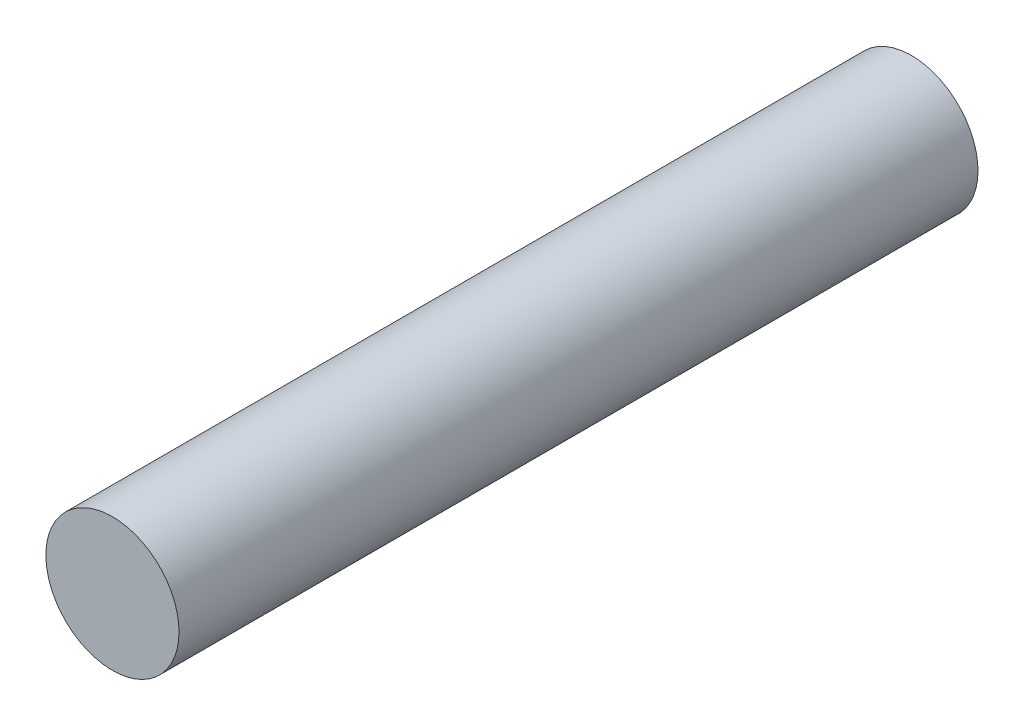
ISO-10303-21;
HEADER;
FILE_DESCRIPTION(('STEP AP214'),'2;1');
FILE_NAME('part.step','',(''),(''),'','','');
FILE_SCHEMA(('AUTOMOTIVE_DESIGN { 1 0 10303 214 1 1 1 1 }'));
ENDSEC;
DATA;
#1=APPLICATION_CONTEXT('core data for automotive mechanical design processes');
#2=APPLICATION_PROTOCOL_DEFINITION('international standard','automotive_design',2000,#1);
#3=PRODUCT_CONTEXT('',#1,'mechanical');
#4=PRODUCT('Part','Part','',(#3));
#5=PRODUCT_RELATED_PRODUCT_CATEGORY('part','',(#4));
#6=PRODUCT_DEFINITION_FORMATION('','',#4);
#7=PRODUCT_DEFINITION_CONTEXT('part definition',#1,'design');
#8=PRODUCT_DEFINITION('design','',#6,#7);
#9=PRODUCT_DEFINITION_SHAPE('','',#8);
#10=(LENGTH_UNIT() NAMED_UNIT(*) SI_UNIT(.MILLI.,.METRE.));
#11=(NAMED_UNIT(*) PLANE_ANGLE_UNIT() SI_UNIT($,.RADIAN.));
#12=(NAMED_UNIT(*) SI_UNIT($,.STERADIAN.) SOLID_ANGLE_UNIT());
#13=UNCERTAINTY_MEASURE_WITH_UNIT(LENGTH_MEASURE(1.E-05),#10,'distance_accuracy_value','');
#14=(GEOMETRIC_REPRESENTATION_CONTEXT(3) GLOBAL_UNCERTAINTY_ASSIGNED_CONTEXT((#13)) GLOBAL_UNIT_ASSIGNED_CONTEXT((#10,
#11,#12)) REPRESENTATION_CONTEXT('',''));
#15=CARTESIAN_POINT('',(0.,0.,0.));
#16=DIRECTION('',(0.,0.,1.));
#17=DIRECTION('',(1.,0.,0.));
#18=AXIS2_PLACEMENT_3D('',#15,#16,#17);
#19=CARTESIAN_POINT('',(0.,0.,48.));
#20=DIRECTION('',(0.,0.,-1.));
#21=DIRECTION('',(-1.,0.,0.));
#22=AXIS2_PLACEMENT_3D('',#19,#20,#21);
#23=CYLINDRICAL_SURFACE('',#22,4.);
#24=CARTESIAN_POINT('',(0.,0.,48.));
#25=DIRECTION('',(0.,0.,1.));
#26=DIRECTION('',(1.,0.,0.));
#27=AXIS2_PLACEMENT_3D('',#24,#25,#26);
#28=CIRCLE('',#27,4.);
#29=CARTESIAN_POINT('',(4.,0.,48.));
#30=VERTEX_POINT('',#29);
#31=EDGE_CURVE('E10',#30,#30,#28,.T.);
#32=ORIENTED_EDGE('',*,*,#31,.F.);
#33=EDGE_LOOP('',(#32));
#34=FACE_BOUND('',#33,.T.);
#35=CARTESIAN_POINT('',(0.,0.,0.));
#36=DIRECTION('',(0.,0.,1.));
#37=DIRECTION('',(1.,0.,0.));
#38=AXIS2_PLACEMENT_3D('',#35,#36,#37);
#39=CIRCLE('',#38,4.);
#40=CARTESIAN_POINT('',(4.,0.,0.));
#41=VERTEX_POINT('',#40);
#42=EDGE_CURVE('E35',#41,#41,#39,.T.);
#43=ORIENTED_EDGE('',*,*,#42,.T.);
#44=EDGE_LOOP('',(#43));
#45=FACE_BOUND('',#44,.T.);
#46=ADVANCED_FACE('F32',(#34,#45),#23,.T.);
#47=CARTESIAN_POINT('',(0.,0.,48.));
#48=DIRECTION('',(0.,0.,1.));
#49=DIRECTION('',(1.,0.,0.));
#50=AXIS2_PLACEMENT_3D('',#47,#48,#49);
#51=PLANE('',#50);
#52=ORIENTED_EDGE('',*,*,#31,.T.);
#53=EDGE_LOOP('',(#52));
#54=FACE_BOUND('',#53,.T.);
#55=ADVANCED_FACE('F47',(#54),#51,.T.);
#56=CARTESIAN_POINT('',(0.,0.,0.));
#57=DIRECTION('',(0.,0.,1.));
#58=DIRECTION('',(1.,0.,0.));
#59=AXIS2_PLACEMENT_3D('',#56,#57,#58);
#60=PLANE('',#59);
#61=ORIENTED_EDGE('',*,*,#42,.F.);
#62=EDGE_LOOP('',(#61));
#63=FACE_BOUND('',#62,.T.);
#64=ADVANCED_FACE('F45',(#63),#60,.F.);
#65=CLOSED_SHELL('',(#46,#55,#64));
#66=MANIFOLD_SOLID_BREP('B2',#65);
#67=ADVANCED_BREP_SHAPE_REPRESENTATION('',(#18,#66),#14);
#68=SHAPE_DEFINITION_REPRESENTATION(#9,#67);
ENDSEC;
END-ISO-10303-21;
